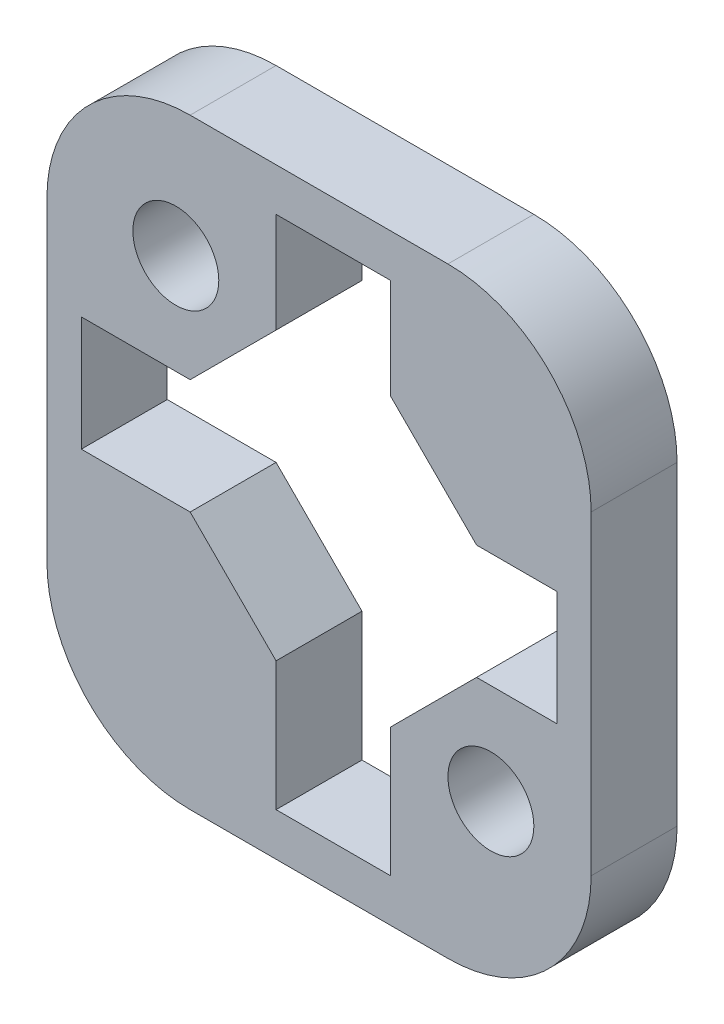
ISO-10303-21;
HEADER;
FILE_DESCRIPTION(('STEP AP214'),'2;1');
FILE_NAME('part.step','',(''),(''),'','','');
FILE_SCHEMA(('AUTOMOTIVE_DESIGN { 1 0 10303 214 1 1 1 1 }'));
ENDSEC;
DATA;
#1=APPLICATION_CONTEXT('core data for automotive mechanical design processes');
#2=APPLICATION_PROTOCOL_DEFINITION('international standard','automotive_design',2000,#1);
#3=PRODUCT_CONTEXT('',#1,'mechanical');
#4=PRODUCT('Part','Part','',(#3));
#5=PRODUCT_RELATED_PRODUCT_CATEGORY('part','',(#4));
#6=PRODUCT_DEFINITION_FORMATION('','',#4);
#7=PRODUCT_DEFINITION_CONTEXT('part definition',#1,'design');
#8=PRODUCT_DEFINITION('design','',#6,#7);
#9=PRODUCT_DEFINITION_SHAPE('','',#8);
#10=(LENGTH_UNIT() NAMED_UNIT(*) SI_UNIT(.MILLI.,.METRE.));
#11=(NAMED_UNIT(*) PLANE_ANGLE_UNIT() SI_UNIT($,.RADIAN.));
#12=(NAMED_UNIT(*) SI_UNIT($,.STERADIAN.) SOLID_ANGLE_UNIT());
#13=UNCERTAINTY_MEASURE_WITH_UNIT(LENGTH_MEASURE(1.E-05),#10,'distance_accuracy_value','');
#14=(GEOMETRIC_REPRESENTATION_CONTEXT(3) GLOBAL_UNCERTAINTY_ASSIGNED_CONTEXT((#13)) GLOBAL_UNIT_ASSIGNED_CONTEXT((#10,
#11,#12)) REPRESENTATION_CONTEXT('',''));
#15=CARTESIAN_POINT('',(0.,0.,0.));
#16=DIRECTION('',(0.,0.,1.));
#17=DIRECTION('',(1.,0.,0.));
#18=AXIS2_PLACEMENT_3D('',#15,#16,#17);
#19=CARTESIAN_POINT('',(4.5,-5.5,3.));
#20=DIRECTION('',(0.,0.,-1.));
#21=DIRECTION('',(-1.,0.,0.));
#22=AXIS2_PLACEMENT_3D('',#19,#20,#21);
#23=CYLINDRICAL_SURFACE('',#22,5.);
#24=CARTESIAN_POINT('',(4.5,-5.5,0.));
#25=DIRECTION('',(0.,0.,1.));
#26=DIRECTION('',(-1.,0.,0.));
#27=AXIS2_PLACEMENT_3D('',#24,#25,#26);
#28=CIRCLE('',#27,5.);
#29=CARTESIAN_POINT('',(4.5,-10.5,0.));
#30=VERTEX_POINT('',#29);
#31=CARTESIAN_POINT('',(9.5,-5.49999999999999,0.));
#32=VERTEX_POINT('',#31);
#33=EDGE_CURVE('E227',#30,#32,#28,.T.);
#34=ORIENTED_EDGE('',*,*,#33,.T.);
#35=DIRECTION('',(0.,0.,-1.));
#36=VECTOR('',#35,1.);
#37=CARTESIAN_POINT('',(9.5,-5.49999999999999,3.));
#38=LINE('',#37,#36);
#39=CARTESIAN_POINT('',(9.5,-5.49999999999999,3.));
#40=VERTEX_POINT('',#39);
#41=EDGE_CURVE('E291',#40,#32,#38,.T.);
#42=ORIENTED_EDGE('',*,*,#41,.F.);
#43=CARTESIAN_POINT('',(4.5,-5.5,3.));
#44=DIRECTION('',(0.,0.,1.));
#45=DIRECTION('',(-1.,0.,0.));
#46=AXIS2_PLACEMENT_3D('',#43,#44,#45);
#47=CIRCLE('',#46,5.);
#48=CARTESIAN_POINT('',(4.5,-10.5,3.));
#49=VERTEX_POINT('',#48);
#50=EDGE_CURVE('E237',#49,#40,#47,.T.);
#51=ORIENTED_EDGE('',*,*,#50,.F.);
#52=DIRECTION('',(0.,0.,-1.));
#53=VECTOR('',#52,1.);
#54=CARTESIAN_POINT('',(4.5,-10.5,3.));
#55=LINE('',#54,#53);
#56=EDGE_CURVE('E255',#49,#30,#55,.T.);
#57=ORIENTED_EDGE('',*,*,#56,.T.);
#58=EDGE_LOOP('',(#34,#42,#51,#57));
#59=FACE_BOUND('',#58,.T.);
#60=ADVANCED_FACE('F33',(#59),#23,.T.);
#61=CARTESIAN_POINT('',(9.5,5.50000000000001,3.));
#62=DIRECTION('',(-1.,0.,0.));
#63=DIRECTION('',(0.,-1.,0.));
#64=AXIS2_PLACEMENT_3D('',#61,#62,#63);
#65=PLANE('',#64);
#66=DIRECTION('',(0.,1.,0.));
#67=VECTOR('',#66,1.);
#68=CARTESIAN_POINT('',(9.5,5.50000000000001,0.));
#69=LINE('',#68,#67);
#70=CARTESIAN_POINT('',(9.5,5.50000000000001,0.));
#71=VERTEX_POINT('',#70);
#72=EDGE_CURVE('E258',#32,#71,#69,.T.);
#73=ORIENTED_EDGE('',*,*,#72,.T.);
#74=DIRECTION('',(0.,0.,-1.));
#75=VECTOR('',#74,1.);
#76=CARTESIAN_POINT('',(9.5,5.50000000000001,3.));
#77=LINE('',#76,#75);
#78=CARTESIAN_POINT('',(9.5,5.50000000000001,3.));
#79=VERTEX_POINT('',#78);
#80=EDGE_CURVE('E288',#79,#71,#77,.T.);
#81=ORIENTED_EDGE('',*,*,#80,.F.);
#82=DIRECTION('',(0.,1.,0.));
#83=VECTOR('',#82,1.);
#84=CARTESIAN_POINT('',(9.5,5.50000000000001,3.));
#85=LINE('',#84,#83);
#86=EDGE_CURVE('E240',#40,#79,#85,.T.);
#87=ORIENTED_EDGE('',*,*,#86,.F.);
#88=ORIENTED_EDGE('',*,*,#41,.T.);
#89=EDGE_LOOP('',(#73,#81,#87,#88));
#90=FACE_BOUND('',#89,.T.);
#91=ADVANCED_FACE('F455',(#90),#65,.F.);
#92=CARTESIAN_POINT('',(4.5,5.50000000000001,3.));
#93=DIRECTION('',(0.,0.,-1.));
#94=DIRECTION('',(-1.,0.,0.));
#95=AXIS2_PLACEMENT_3D('',#92,#93,#94);
#96=CYLINDRICAL_SURFACE('',#95,5.);
#97=CARTESIAN_POINT('',(4.5,5.50000000000001,0.));
#98=DIRECTION('',(0.,0.,1.));
#99=DIRECTION('',(-1.,0.,0.));
#100=AXIS2_PLACEMENT_3D('',#97,#98,#99);
#101=CIRCLE('',#100,5.);
#102=CARTESIAN_POINT('',(4.5,10.5,0.));
#103=VERTEX_POINT('',#102);
#104=EDGE_CURVE('E260',#71,#103,#101,.T.);
#105=ORIENTED_EDGE('',*,*,#104,.T.);
#106=DIRECTION('',(0.,0.,-1.));
#107=VECTOR('',#106,1.);
#108=CARTESIAN_POINT('',(4.5,10.5,3.));
#109=LINE('',#108,#107);
#110=CARTESIAN_POINT('',(4.5,10.5,3.));
#111=VERTEX_POINT('',#110);
#112=EDGE_CURVE('E285',#111,#103,#109,.T.);
#113=ORIENTED_EDGE('',*,*,#112,.F.);
#114=CARTESIAN_POINT('',(4.5,5.50000000000001,3.));
#115=DIRECTION('',(0.,0.,1.));
#116=DIRECTION('',(-1.,0.,0.));
#117=AXIS2_PLACEMENT_3D('',#114,#115,#116);
#118=CIRCLE('',#117,5.);
#119=EDGE_CURVE('E243',#79,#111,#118,.T.);
#120=ORIENTED_EDGE('',*,*,#119,.F.);
#121=ORIENTED_EDGE('',*,*,#80,.T.);
#122=EDGE_LOOP('',(#105,#113,#120,#121));
#123=FACE_BOUND('',#122,.T.);
#124=ADVANCED_FACE('F461',(#123),#96,.T.);
#125=CARTESIAN_POINT('',(4.5,10.5,3.));
#126=DIRECTION('',(0.,-1.,0.));
#127=DIRECTION('',(0.,0.,-1.));
#128=AXIS2_PLACEMENT_3D('',#125,#126,#127);
#129=PLANE('',#128);
#130=DIRECTION('',(-1.,0.,0.));
#131=VECTOR('',#130,1.);
#132=CARTESIAN_POINT('',(4.5,10.5,0.));
#133=LINE('',#132,#131);
#134=CARTESIAN_POINT('',(-4.5,10.5,0.));
#135=VERTEX_POINT('',#134);
#136=EDGE_CURVE('E262',#103,#135,#133,.T.);
#137=ORIENTED_EDGE('',*,*,#136,.T.);
#138=DIRECTION('',(0.,0.,-1.));
#139=VECTOR('',#138,1.);
#140=CARTESIAN_POINT('',(-4.5,10.5,3.));
#141=LINE('',#140,#139);
#142=CARTESIAN_POINT('',(-4.5,10.5,3.));
#143=VERTEX_POINT('',#142);
#144=EDGE_CURVE('E282',#143,#135,#141,.T.);
#145=ORIENTED_EDGE('',*,*,#144,.F.);
#146=DIRECTION('',(-1.,0.,0.));
#147=VECTOR('',#146,1.);
#148=CARTESIAN_POINT('',(4.5,10.5,3.));
#149=LINE('',#148,#147);
#150=EDGE_CURVE('E245',#111,#143,#149,.T.);
#151=ORIENTED_EDGE('',*,*,#150,.F.);
#152=ORIENTED_EDGE('',*,*,#112,.T.);
#153=EDGE_LOOP('',(#137,#145,#151,#152));
#154=FACE_BOUND('',#153,.T.);
#155=ADVANCED_FACE('F648',(#154),#129,.F.);
#156=CARTESIAN_POINT('',(-4.5,5.50000000000001,3.));
#157=DIRECTION('',(0.,0.,-1.));
#158=DIRECTION('',(-1.,0.,0.));
#159=AXIS2_PLACEMENT_3D('',#156,#157,#158);
#160=CYLINDRICAL_SURFACE('',#159,5.);
#161=CARTESIAN_POINT('',(-4.5,5.50000000000001,0.));
#162=DIRECTION('',(0.,0.,1.));
#163=DIRECTION('',(1.,0.,0.));
#164=AXIS2_PLACEMENT_3D('',#161,#162,#163);
#165=CIRCLE('',#164,5.);
#166=CARTESIAN_POINT('',(-9.5,5.50000000000001,0.));
#167=VERTEX_POINT('',#166);
#168=EDGE_CURVE('E264',#135,#167,#165,.T.);
#169=ORIENTED_EDGE('',*,*,#168,.T.);
#170=DIRECTION('',(0.,0.,-1.));
#171=VECTOR('',#170,1.);
#172=CARTESIAN_POINT('',(-9.5,5.50000000000001,3.));
#173=LINE('',#172,#171);
#174=CARTESIAN_POINT('',(-9.5,5.50000000000001,3.));
#175=VERTEX_POINT('',#174);
#176=EDGE_CURVE('E279',#175,#167,#173,.T.);
#177=ORIENTED_EDGE('',*,*,#176,.F.);
#178=CARTESIAN_POINT('',(-4.5,5.50000000000001,3.));
#179=DIRECTION('',(0.,0.,1.));
#180=DIRECTION('',(1.,0.,0.));
#181=AXIS2_PLACEMENT_3D('',#178,#179,#180);
#182=CIRCLE('',#181,5.);
#183=EDGE_CURVE('E247',#143,#175,#182,.T.);
#184=ORIENTED_EDGE('',*,*,#183,.F.);
#185=ORIENTED_EDGE('',*,*,#144,.T.);
#186=EDGE_LOOP('',(#169,#177,#184,#185));
#187=FACE_BOUND('',#186,.T.);
#188=ADVANCED_FACE('F639',(#187),#160,.T.);
#189=CARTESIAN_POINT('',(-9.5,5.5,3.));
#190=DIRECTION('',(1.,0.,0.));
#191=DIRECTION('',(0.,1.,0.));
#192=AXIS2_PLACEMENT_3D('',#189,#190,#191);
#193=PLANE('',#192);
#194=DIRECTION('',(0.,-1.,0.));
#195=VECTOR('',#194,1.);
#196=CARTESIAN_POINT('',(-9.5,5.5,0.));
#197=LINE('',#196,#195);
#198=CARTESIAN_POINT('',(-9.5,-5.5,0.));
#199=VERTEX_POINT('',#198);
#200=EDGE_CURVE('E266',#167,#199,#197,.T.);
#201=ORIENTED_EDGE('',*,*,#200,.T.);
#202=DIRECTION('',(0.,0.,-1.));
#203=VECTOR('',#202,1.);
#204=CARTESIAN_POINT('',(-9.5,-5.5,3.));
#205=LINE('',#204,#203);
#206=CARTESIAN_POINT('',(-9.5,-5.5,3.));
#207=VERTEX_POINT('',#206);
#208=EDGE_CURVE('E276',#207,#199,#205,.T.);
#209=ORIENTED_EDGE('',*,*,#208,.F.);
#210=DIRECTION('',(0.,-1.,0.));
#211=VECTOR('',#210,1.);
#212=CARTESIAN_POINT('',(-9.5,5.5,3.));
#213=LINE('',#212,#211);
#214=EDGE_CURVE('E249',#175,#207,#213,.T.);
#215=ORIENTED_EDGE('',*,*,#214,.F.);
#216=ORIENTED_EDGE('',*,*,#176,.T.);
#217=EDGE_LOOP('',(#201,#209,#215,#216));
#218=FACE_BOUND('',#217,.T.);
#219=ADVANCED_FACE('F630',(#218),#193,.F.);
#220=CARTESIAN_POINT('',(-4.5,-5.5,3.));
#221=DIRECTION('',(0.,0.,-1.));
#222=DIRECTION('',(-1.,0.,0.));
#223=AXIS2_PLACEMENT_3D('',#220,#221,#222);
#224=CYLINDRICAL_SURFACE('',#223,5.);
#225=CARTESIAN_POINT('',(-4.5,-5.5,0.));
#226=DIRECTION('',(0.,0.,1.));
#227=DIRECTION('',(-1.,0.,0.));
#228=AXIS2_PLACEMENT_3D('',#225,#226,#227);
#229=CIRCLE('',#228,5.);
#230=CARTESIAN_POINT('',(-4.5,-10.5,0.));
#231=VERTEX_POINT('',#230);
#232=EDGE_CURVE('E268',#199,#231,#229,.T.);
#233=ORIENTED_EDGE('',*,*,#232,.T.);
#234=DIRECTION('',(0.,0.,-1.));
#235=VECTOR('',#234,1.);
#236=CARTESIAN_POINT('',(-4.5,-10.5,3.));
#237=LINE('',#236,#235);
#238=CARTESIAN_POINT('',(-4.5,-10.5,3.));
#239=VERTEX_POINT('',#238);
#240=EDGE_CURVE('E273',#239,#231,#237,.T.);
#241=ORIENTED_EDGE('',*,*,#240,.F.);
#242=CARTESIAN_POINT('',(-4.5,-5.5,3.));
#243=DIRECTION('',(0.,0.,1.));
#244=DIRECTION('',(-1.,0.,0.));
#245=AXIS2_PLACEMENT_3D('',#242,#243,#244);
#246=CIRCLE('',#245,5.);
#247=EDGE_CURVE('E251',#207,#239,#246,.T.);
#248=ORIENTED_EDGE('',*,*,#247,.F.);
#249=ORIENTED_EDGE('',*,*,#208,.T.);
#250=EDGE_LOOP('',(#233,#241,#248,#249));
#251=FACE_BOUND('',#250,.T.);
#252=ADVANCED_FACE('F621',(#251),#224,.T.);
#253=CARTESIAN_POINT('',(4.5,-10.5,3.));
#254=DIRECTION('',(0.,1.,0.));
#255=DIRECTION('',(-1.,0.,0.));
#256=AXIS2_PLACEMENT_3D('',#253,#254,#255);
#257=PLANE('',#256);
#258=DIRECTION('',(1.,0.,0.));
#259=VECTOR('',#258,1.);
#260=CARTESIAN_POINT('',(4.5,-10.5,0.));
#261=LINE('',#260,#259);
#262=EDGE_CURVE('E241',#231,#30,#261,.T.);
#263=ORIENTED_EDGE('',*,*,#262,.T.);
#264=ORIENTED_EDGE('',*,*,#56,.F.);
#265=DIRECTION('',(1.,0.,0.));
#266=VECTOR('',#265,1.);
#267=CARTESIAN_POINT('',(4.5,-10.5,3.));
#268=LINE('',#267,#266);
#269=EDGE_CURVE('E253',#239,#49,#268,.T.);
#270=ORIENTED_EDGE('',*,*,#269,.F.);
#271=ORIENTED_EDGE('',*,*,#240,.T.);
#272=EDGE_LOOP('',(#263,#264,#270,#271));
#273=FACE_BOUND('',#272,.T.);
#274=ADVANCED_FACE('F485',(#273),#257,.F.);
#275=CARTESIAN_POINT('',(4.5,-5.5,3.));
#276=DIRECTION('',(0.,0.,-1.));
#277=DIRECTION('',(-1.,0.,0.));
#278=AXIS2_PLACEMENT_3D('',#275,#276,#277);
#279=PLANE('',#278);
#280=DIRECTION('',(0.,1.,0.));
#281=VECTOR('',#280,1.);
#282=CARTESIAN_POINT('',(8.3,-1.50000000000001,3.));
#283=LINE('',#282,#281);
#284=CARTESIAN_POINT('',(8.3,-1.50000000000001,3.));
#285=VERTEX_POINT('',#284);
#286=CARTESIAN_POINT('',(8.3,2.50000000000001,3.));
#287=VERTEX_POINT('',#286);
#288=EDGE_CURVE('E48',#285,#287,#283,.T.);
#289=ORIENTED_EDGE('',*,*,#288,.F.);
#290=DIRECTION('',(-1.,0.,0.));
#291=VECTOR('',#290,1.);
#292=CARTESIAN_POINT('',(2.5,-1.5,3.));
#293=LINE('',#292,#291);
#294=CARTESIAN_POINT('',(5.50000000000001,-1.50000000000001,3.));
#295=VERTEX_POINT('',#294);
#296=EDGE_CURVE('E215',#285,#295,#293,.T.);
#297=ORIENTED_EDGE('',*,*,#296,.T.);
#298=DIRECTION('',(0.707106781186549,0.707106781186546,0.));
#299=VECTOR('',#298,1.);
#300=CARTESIAN_POINT('',(2.5,-4.50000000000001,3.));
#301=LINE('',#300,#299);
#302=CARTESIAN_POINT('',(2.5,-4.50000000000001,3.));
#303=VERTEX_POINT('',#302);
#304=EDGE_CURVE('E315',#295,#303,#301,.F.);
#305=ORIENTED_EDGE('',*,*,#304,.T.);
#306=DIRECTION('',(0.,-1.,0.));
#307=VECTOR('',#306,1.);
#308=CARTESIAN_POINT('',(2.5,-1.5,3.));
#309=LINE('',#308,#307);
#310=CARTESIAN_POINT('',(2.5,-8.99999999999999,3.));
#311=VERTEX_POINT('',#310);
#312=EDGE_CURVE('E218',#303,#311,#309,.T.);
#313=ORIENTED_EDGE('',*,*,#312,.T.);
#314=DIRECTION('',(-1.,0.,0.));
#315=VECTOR('',#314,1.);
#316=CARTESIAN_POINT('',(-1.5,-8.99999999999999,3.));
#317=LINE('',#316,#315);
#318=CARTESIAN_POINT('',(-1.5,-8.99999999999999,3.));
#319=VERTEX_POINT('',#318);
#320=EDGE_CURVE('E393',#311,#319,#317,.T.);
#321=ORIENTED_EDGE('',*,*,#320,.T.);
#322=DIRECTION('',(0.,1.,0.));
#323=VECTOR('',#322,1.);
#324=CARTESIAN_POINT('',(-1.5,-1.5,3.));
#325=LINE('',#324,#323);
#326=CARTESIAN_POINT('',(-1.5,-4.50000000000002,3.));
#327=VERTEX_POINT('',#326);
#328=EDGE_CURVE('E392',#319,#327,#325,.T.);
#329=ORIENTED_EDGE('',*,*,#328,.T.);
#330=DIRECTION('',(0.707106781186546,-0.707106781186549,0.));
#331=VECTOR('',#330,1.);
#332=CARTESIAN_POINT('',(-4.5,-1.5,3.));
#333=LINE('',#332,#331);
#334=CARTESIAN_POINT('',(-4.5,-1.5,3.));
#335=VERTEX_POINT('',#334);
#336=EDGE_CURVE('E309',#327,#335,#333,.F.);
#337=ORIENTED_EDGE('',*,*,#336,.T.);
#338=DIRECTION('',(-1.,0.,0.));
#339=VECTOR('',#338,1.);
#340=CARTESIAN_POINT('',(-9.,-1.5,3.));
#341=LINE('',#340,#339);
#342=CARTESIAN_POINT('',(-8.3,-1.5,3.));
#343=VERTEX_POINT('',#342);
#344=EDGE_CURVE('E334',#335,#343,#341,.T.);
#345=ORIENTED_EDGE('',*,*,#344,.T.);
#346=DIRECTION('',(0.,-1.,0.));
#347=VECTOR('',#346,1.);
#348=CARTESIAN_POINT('',(-8.3,2.50000000000001,3.));
#349=LINE('',#348,#347);
#350=CARTESIAN_POINT('',(-8.3,2.50000000000001,3.));
#351=VERTEX_POINT('',#350);
#352=EDGE_CURVE('E56',#351,#343,#349,.T.);
#353=ORIENTED_EDGE('',*,*,#352,.F.);
#354=DIRECTION('',(1.,0.,0.));
#355=VECTOR('',#354,1.);
#356=CARTESIAN_POINT('',(-9.,2.50000000000001,3.));
#357=LINE('',#356,#355);
#358=CARTESIAN_POINT('',(-4.50000000000002,2.50000000000001,3.));
#359=VERTEX_POINT('',#358);
#360=EDGE_CURVE('E395',#351,#359,#357,.T.);
#361=ORIENTED_EDGE('',*,*,#360,.T.);
#362=DIRECTION('',(-0.707106781186549,-0.707106781186546,0.));
#363=VECTOR('',#362,1.);
#364=CARTESIAN_POINT('',(-1.5,5.50000000000001,3.));
#365=LINE('',#364,#363);
#366=CARTESIAN_POINT('',(-1.5,5.50000000000001,3.));
#367=VERTEX_POINT('',#366);
#368=EDGE_CURVE('E311',#359,#367,#365,.F.);
#369=ORIENTED_EDGE('',*,*,#368,.T.);
#370=DIRECTION('',(0.,1.,0.));
#371=VECTOR('',#370,1.);
#372=CARTESIAN_POINT('',(-1.5,9.00000000000001,3.));
#373=LINE('',#372,#371);
#374=CARTESIAN_POINT('',(-1.5,9.00000000000001,3.));
#375=VERTEX_POINT('',#374);
#376=EDGE_CURVE('E401',#367,#375,#373,.T.);
#377=ORIENTED_EDGE('',*,*,#376,.T.);
#378=DIRECTION('',(1.,0.,0.));
#379=VECTOR('',#378,1.);
#380=CARTESIAN_POINT('',(-1.5,9.00000000000001,3.));
#381=LINE('',#380,#379);
#382=CARTESIAN_POINT('',(2.5,9.00000000000001,3.));
#383=VERTEX_POINT('',#382);
#384=EDGE_CURVE('E372',#375,#383,#381,.T.);
#385=ORIENTED_EDGE('',*,*,#384,.T.);
#386=DIRECTION('',(0.,-1.,0.));
#387=VECTOR('',#386,1.);
#388=CARTESIAN_POINT('',(2.5,9.00000000000001,3.));
#389=LINE('',#388,#387);
#390=CARTESIAN_POINT('',(2.5,5.50000000000001,3.));
#391=VERTEX_POINT('',#390);
#392=EDGE_CURVE('E370',#383,#391,#389,.T.);
#393=ORIENTED_EDGE('',*,*,#392,.T.);
#394=DIRECTION('',(-0.707106781186546,0.707106781186549,0.));
#395=VECTOR('',#394,1.);
#396=CARTESIAN_POINT('',(5.5,2.50000000000001,3.));
#397=LINE('',#396,#395);
#398=CARTESIAN_POINT('',(5.5,2.50000000000001,3.));
#399=VERTEX_POINT('',#398);
#400=EDGE_CURVE('E313',#391,#399,#397,.F.);
#401=ORIENTED_EDGE('',*,*,#400,.T.);
#402=DIRECTION('',(1.,0.,0.));
#403=VECTOR('',#402,1.);
#404=CARTESIAN_POINT('',(2.5,2.5,3.));
#405=LINE('',#404,#403);
#406=EDGE_CURVE('E236',#399,#287,#405,.T.);
#407=ORIENTED_EDGE('',*,*,#406,.T.);
#408=EDGE_LOOP('',(#289,#297,#305,#313,#321,#329,#337,#345,#353,#361,#369,#377,#385,#393,#401,#407));
#409=FACE_BOUND('',#408,.T.);
#410=CARTESIAN_POINT('',(6.,-5.00000000000001,3.));
#411=DIRECTION('',(0.,0.,1.));
#412=DIRECTION('',(1.,0.,0.));
#413=AXIS2_PLACEMENT_3D('',#410,#411,#412);
#414=CIRCLE('',#413,1.5);
#415=CARTESIAN_POINT('',(7.5,-5.00000000000001,3.));
#416=VERTEX_POINT('',#415);
#417=EDGE_CURVE('E424',#416,#416,#414,.T.);
#418=ORIENTED_EDGE('',*,*,#417,.F.);
#419=EDGE_LOOP('',(#418));
#420=FACE_BOUND('',#419,.T.);
#421=CARTESIAN_POINT('',(-5.,6.00000000000001,3.));
#422=DIRECTION('',(0.,0.,1.));
#423=DIRECTION('',(1.,0.,0.));
#424=AXIS2_PLACEMENT_3D('',#421,#422,#423);
#425=CIRCLE('',#424,1.5);
#426=CARTESIAN_POINT('',(-3.5,6.00000000000001,3.));
#427=VERTEX_POINT('',#426);
#428=EDGE_CURVE('E416',#427,#427,#425,.T.);
#429=ORIENTED_EDGE('',*,*,#428,.F.);
#430=EDGE_LOOP('',(#429));
#431=FACE_BOUND('',#430,.T.);
#432=ORIENTED_EDGE('',*,*,#50,.T.);
#433=ORIENTED_EDGE('',*,*,#86,.T.);
#434=ORIENTED_EDGE('',*,*,#119,.T.);
#435=ORIENTED_EDGE('',*,*,#150,.T.);
#436=ORIENTED_EDGE('',*,*,#183,.T.);
#437=ORIENTED_EDGE('',*,*,#214,.T.);
#438=ORIENTED_EDGE('',*,*,#247,.T.);
#439=ORIENTED_EDGE('',*,*,#269,.T.);
#440=EDGE_LOOP('',(#432,#433,#434,#435,#436,#437,#438,#439));
#441=FACE_BOUND('',#440,.T.);
#442=ADVANCED_FACE('F367',(#409,#420,#431,#441),#279,.F.);
#443=CARTESIAN_POINT('',(4.5,-5.5,0.));
#444=DIRECTION('',(0.,0.,-1.));
#445=DIRECTION('',(-1.,0.,0.));
#446=AXIS2_PLACEMENT_3D('',#443,#444,#445);
#447=PLANE('',#446);
#448=DIRECTION('',(-1.,0.,0.));
#449=VECTOR('',#448,1.);
#450=CARTESIAN_POINT('',(2.5,-1.5,0.));
#451=LINE('',#450,#449);
#452=CARTESIAN_POINT('',(8.3,-1.50000000000001,0.));
#453=VERTEX_POINT('',#452);
#454=CARTESIAN_POINT('',(5.50000000000001,-1.50000000000001,0.));
#455=VERTEX_POINT('',#454);
#456=EDGE_CURVE('E201',#453,#455,#451,.T.);
#457=ORIENTED_EDGE('',*,*,#456,.F.);
#458=DIRECTION('',(0.,-1.,0.));
#459=VECTOR('',#458,1.);
#460=CARTESIAN_POINT('',(8.3,2.50000000000001,0.));
#461=LINE('',#460,#459);
#462=CARTESIAN_POINT('',(8.3,2.50000000000001,0.));
#463=VERTEX_POINT('',#462);
#464=EDGE_CURVE('E195',#463,#453,#461,.T.);
#465=ORIENTED_EDGE('',*,*,#464,.F.);
#466=DIRECTION('',(1.,0.,0.));
#467=VECTOR('',#466,1.);
#468=CARTESIAN_POINT('',(2.5,2.5,0.));
#469=LINE('',#468,#467);
#470=CARTESIAN_POINT('',(5.5,2.50000000000001,0.));
#471=VERTEX_POINT('',#470);
#472=EDGE_CURVE('E199',#471,#463,#469,.T.);
#473=ORIENTED_EDGE('',*,*,#472,.F.);
#474=DIRECTION('',(0.707106781186546,-0.707106781186549,0.));
#475=VECTOR('',#474,1.);
#476=CARTESIAN_POINT('',(9.,-1.00000000000001,0.));
#477=LINE('',#476,#475);
#478=CARTESIAN_POINT('',(2.5,5.50000000000001,0.));
#479=VERTEX_POINT('',#478);
#480=EDGE_CURVE('E302',#471,#479,#477,.F.);
#481=ORIENTED_EDGE('',*,*,#480,.T.);
#482=DIRECTION('',(0.,-1.,0.));
#483=VECTOR('',#482,1.);
#484=CARTESIAN_POINT('',(2.5,9.00000000000001,0.));
#485=LINE('',#484,#483);
#486=CARTESIAN_POINT('',(2.5,9.00000000000001,0.));
#487=VERTEX_POINT('',#486);
#488=EDGE_CURVE('E216',#487,#479,#485,.T.);
#489=ORIENTED_EDGE('',*,*,#488,.F.);
#490=DIRECTION('',(1.,0.,0.));
#491=VECTOR('',#490,1.);
#492=CARTESIAN_POINT('',(-1.5,9.00000000000001,0.));
#493=LINE('',#492,#491);
#494=CARTESIAN_POINT('',(-1.5,9.00000000000001,0.));
#495=VERTEX_POINT('',#494);
#496=EDGE_CURVE('E221',#495,#487,#493,.T.);
#497=ORIENTED_EDGE('',*,*,#496,.F.);
#498=DIRECTION('',(0.,1.,0.));
#499=VECTOR('',#498,1.);
#500=CARTESIAN_POINT('',(-1.5,9.00000000000001,0.));
#501=LINE('',#500,#499);
#502=CARTESIAN_POINT('',(-1.5,5.50000000000001,0.));
#503=VERTEX_POINT('',#502);
#504=EDGE_CURVE('E344',#503,#495,#501,.T.);
#505=ORIENTED_EDGE('',*,*,#504,.F.);
#506=DIRECTION('',(0.707106781186549,0.707106781186546,0.));
#507=VECTOR('',#506,1.);
#508=CARTESIAN_POINT('',(-3.99999999999999,3.00000000000003,0.));
#509=LINE('',#508,#507);
#510=CARTESIAN_POINT('',(-4.50000000000002,2.50000000000001,0.));
#511=VERTEX_POINT('',#510);
#512=EDGE_CURVE('E299',#503,#511,#509,.F.);
#513=ORIENTED_EDGE('',*,*,#512,.T.);
#514=DIRECTION('',(1.,0.,0.));
#515=VECTOR('',#514,1.);
#516=CARTESIAN_POINT('',(-9.,2.50000000000001,0.));
#517=LINE('',#516,#515);
#518=CARTESIAN_POINT('',(-8.3,2.50000000000001,0.));
#519=VERTEX_POINT('',#518);
#520=EDGE_CURVE('E341',#519,#511,#517,.T.);
#521=ORIENTED_EDGE('',*,*,#520,.F.);
#522=DIRECTION('',(0.,1.,0.));
#523=VECTOR('',#522,1.);
#524=CARTESIAN_POINT('',(-8.3,-1.5,0.));
#525=LINE('',#524,#523);
#526=CARTESIAN_POINT('',(-8.3,-1.5,0.));
#527=VERTEX_POINT('',#526);
#528=EDGE_CURVE('E340',#527,#519,#525,.T.);
#529=ORIENTED_EDGE('',*,*,#528,.F.);
#530=DIRECTION('',(-1.,0.,0.));
#531=VECTOR('',#530,1.);
#532=CARTESIAN_POINT('',(-9.,-1.5,0.));
#533=LINE('',#532,#531);
#534=CARTESIAN_POINT('',(-4.5,-1.5,0.));
#535=VERTEX_POINT('',#534);
#536=EDGE_CURVE('E332',#535,#527,#533,.T.);
#537=ORIENTED_EDGE('',*,*,#536,.F.);
#538=DIRECTION('',(-0.707106781186546,0.707106781186549,0.));
#539=VECTOR('',#538,1.);
#540=CARTESIAN_POINT('',(1.99999999999998,-8.00000000000001,0.));
#541=LINE('',#540,#539);
#542=CARTESIAN_POINT('',(-1.5,-4.50000000000002,0.));
#543=VERTEX_POINT('',#542);
#544=EDGE_CURVE('E297',#535,#543,#541,.F.);
#545=ORIENTED_EDGE('',*,*,#544,.T.);
#546=DIRECTION('',(0.,1.,0.));
#547=VECTOR('',#546,1.);
#548=CARTESIAN_POINT('',(-1.5,-1.5,0.));
#549=LINE('',#548,#547);
#550=CARTESIAN_POINT('',(-1.5,-8.99999999999999,0.));
#551=VERTEX_POINT('',#550);
#552=EDGE_CURVE('E342',#551,#543,#549,.T.);
#553=ORIENTED_EDGE('',*,*,#552,.F.);
#554=DIRECTION('',(-1.,0.,0.));
#555=VECTOR('',#554,1.);
#556=CARTESIAN_POINT('',(-1.5,-8.99999999999999,0.));
#557=LINE('',#556,#555);
#558=CARTESIAN_POINT('',(2.5,-8.99999999999999,0.));
#559=VERTEX_POINT('',#558);
#560=EDGE_CURVE('E346',#559,#551,#557,.T.);
#561=ORIENTED_EDGE('',*,*,#560,.F.);
#562=DIRECTION('',(0.,-1.,0.));
#563=VECTOR('',#562,1.);
#564=CARTESIAN_POINT('',(2.5,-1.5,0.));
#565=LINE('',#564,#563);
#566=CARTESIAN_POINT('',(2.5,-4.50000000000001,0.));
#567=VERTEX_POINT('',#566);
#568=EDGE_CURVE('E377',#567,#559,#565,.T.);
#569=ORIENTED_EDGE('',*,*,#568,.F.);
#570=DIRECTION('',(-0.707106781186549,-0.707106781186546,0.));
#571=VECTOR('',#570,1.);
#572=CARTESIAN_POINT('',(3.00000000000001,-4.,0.));
#573=LINE('',#572,#571);
#574=EDGE_CURVE('E304',#567,#455,#573,.F.);
#575=ORIENTED_EDGE('',*,*,#574,.T.);
#576=EDGE_LOOP('',(#457,#465,#473,#481,#489,#497,#505,#513,#521,#529,#537,#545,#553,#561,#569,#575));
#577=FACE_BOUND('',#576,.T.);
#578=CARTESIAN_POINT('',(6.,-5.00000000000001,0.));
#579=DIRECTION('',(0.,0.,1.));
#580=DIRECTION('',(1.,0.,0.));
#581=AXIS2_PLACEMENT_3D('',#578,#579,#580);
#582=CIRCLE('',#581,1.5);
#583=CARTESIAN_POINT('',(7.5,-5.00000000000001,0.));
#584=VERTEX_POINT('',#583);
#585=EDGE_CURVE('E378',#584,#584,#582,.T.);
#586=ORIENTED_EDGE('',*,*,#585,.T.);
#587=EDGE_LOOP('',(#586));
#588=FACE_BOUND('',#587,.T.);
#589=CARTESIAN_POINT('',(-5.,6.00000000000001,0.));
#590=DIRECTION('',(0.,0.,1.));
#591=DIRECTION('',(1.,0.,0.));
#592=AXIS2_PLACEMENT_3D('',#589,#590,#591);
#593=CIRCLE('',#592,1.5);
#594=CARTESIAN_POINT('',(-3.5,6.00000000000001,0.));
#595=VERTEX_POINT('',#594);
#596=EDGE_CURVE('E427',#595,#595,#593,.T.);
#597=ORIENTED_EDGE('',*,*,#596,.T.);
#598=EDGE_LOOP('',(#597));
#599=FACE_BOUND('',#598,.T.);
#600=ORIENTED_EDGE('',*,*,#33,.F.);
#601=ORIENTED_EDGE('',*,*,#262,.F.);
#602=ORIENTED_EDGE('',*,*,#232,.F.);
#603=ORIENTED_EDGE('',*,*,#200,.F.);
#604=ORIENTED_EDGE('',*,*,#168,.F.);
#605=ORIENTED_EDGE('',*,*,#136,.F.);
#606=ORIENTED_EDGE('',*,*,#104,.F.);
#607=ORIENTED_EDGE('',*,*,#72,.F.);
#608=EDGE_LOOP('',(#600,#601,#602,#603,#604,#605,#606,#607));
#609=FACE_BOUND('',#608,.T.);
#610=ADVANCED_FACE('F196',(#577,#588,#599,#609),#447,.T.);
#611=CARTESIAN_POINT('',(2.5,-1.5,3.));
#612=DIRECTION('',(0.,-1.,0.));
#613=DIRECTION('',(1.,0.,0.));
#614=AXIS2_PLACEMENT_3D('',#611,#612,#613);
#615=PLANE('',#614);
#616=ORIENTED_EDGE('',*,*,#296,.F.);
#617=DIRECTION('',(0.,0.,1.));
#618=VECTOR('',#617,1.);
#619=CARTESIAN_POINT('',(8.3,-1.50000000000001,0.));
#620=LINE('',#619,#618);
#621=EDGE_CURVE('E203',#453,#285,#620,.T.);
#622=ORIENTED_EDGE('',*,*,#621,.F.);
#623=ORIENTED_EDGE('',*,*,#456,.T.);
#624=DIRECTION('',(0.,0.,1.));
#625=VECTOR('',#624,1.);
#626=CARTESIAN_POINT('',(5.50000000000001,-1.50000000000001,3.));
#627=LINE('',#626,#625);
#628=EDGE_CURVE('E306',#455,#295,#627,.T.);
#629=ORIENTED_EDGE('',*,*,#628,.T.);
#630=EDGE_LOOP('',(#616,#622,#623,#629));
#631=FACE_BOUND('',#630,.T.);
#632=ADVANCED_FACE('F441',(#631),#615,.F.);
#633=CARTESIAN_POINT('',(2.5,2.5,3.));
#634=DIRECTION('',(0.,1.,0.));
#635=DIRECTION('',(-1.,0.,0.));
#636=AXIS2_PLACEMENT_3D('',#633,#634,#635);
#637=PLANE('',#636);
#638=ORIENTED_EDGE('',*,*,#472,.T.);
#639=DIRECTION('',(0.,0.,-1.));
#640=VECTOR('',#639,1.);
#641=CARTESIAN_POINT('',(8.3,2.50000000000001,3.));
#642=LINE('',#641,#640);
#643=EDGE_CURVE('E204',#287,#463,#642,.T.);
#644=ORIENTED_EDGE('',*,*,#643,.F.);
#645=ORIENTED_EDGE('',*,*,#406,.F.);
#646=DIRECTION('',(0.,0.,-1.));
#647=VECTOR('',#646,1.);
#648=CARTESIAN_POINT('',(5.5,2.50000000000001,3.));
#649=LINE('',#648,#647);
#650=EDGE_CURVE('E214',#399,#471,#649,.T.);
#651=ORIENTED_EDGE('',*,*,#650,.T.);
#652=EDGE_LOOP('',(#638,#644,#645,#651));
#653=FACE_BOUND('',#652,.T.);
#654=ADVANCED_FACE('F212',(#653),#637,.F.);
#655=CARTESIAN_POINT('',(2.5,9.00000000000001,3.));
#656=DIRECTION('',(1.,0.,0.));
#657=DIRECTION('',(0.,0.,-1.));
#658=AXIS2_PLACEMENT_3D('',#655,#656,#657);
#659=PLANE('',#658);
#660=ORIENTED_EDGE('',*,*,#488,.T.);
#661=DIRECTION('',(0.,0.,1.));
#662=VECTOR('',#661,1.);
#663=CARTESIAN_POINT('',(2.5,5.50000000000001,3.));
#664=LINE('',#663,#662);
#665=EDGE_CURVE('E318',#479,#391,#664,.T.);
#666=ORIENTED_EDGE('',*,*,#665,.T.);
#667=ORIENTED_EDGE('',*,*,#392,.F.);
#668=DIRECTION('',(0.,0.,-1.));
#669=VECTOR('',#668,1.);
#670=CARTESIAN_POINT('',(2.5,9.00000000000001,3.));
#671=LINE('',#670,#669);
#672=EDGE_CURVE('E225',#383,#487,#671,.T.);
#673=ORIENTED_EDGE('',*,*,#672,.T.);
#674=EDGE_LOOP('',(#660,#666,#667,#673));
#675=FACE_BOUND('',#674,.T.);
#676=ADVANCED_FACE('F361',(#675),#659,.F.);
#677=CARTESIAN_POINT('',(-1.5,9.00000000000001,3.));
#678=DIRECTION('',(0.,1.,0.));
#679=DIRECTION('',(-1.,0.,0.));
#680=AXIS2_PLACEMENT_3D('',#677,#678,#679);
#681=PLANE('',#680);
#682=ORIENTED_EDGE('',*,*,#496,.T.);
#683=ORIENTED_EDGE('',*,*,#672,.F.);
#684=ORIENTED_EDGE('',*,*,#384,.F.);
#685=DIRECTION('',(0.,0.,-1.));
#686=VECTOR('',#685,1.);
#687=CARTESIAN_POINT('',(-1.5,9.00000000000001,3.));
#688=LINE('',#687,#686);
#689=EDGE_CURVE('E228',#375,#495,#688,.T.);
#690=ORIENTED_EDGE('',*,*,#689,.T.);
#691=EDGE_LOOP('',(#682,#683,#684,#690));
#692=FACE_BOUND('',#691,.T.);
#693=ADVANCED_FACE('F354',(#692),#681,.F.);
#694=CARTESIAN_POINT('',(-1.5,9.00000000000001,3.));
#695=DIRECTION('',(-1.,0.,0.));
#696=DIRECTION('',(0.,-1.,0.));
#697=AXIS2_PLACEMENT_3D('',#694,#695,#696);
#698=PLANE('',#697);
#699=ORIENTED_EDGE('',*,*,#376,.F.);
#700=DIRECTION('',(0.,0.,-1.));
#701=VECTOR('',#700,1.);
#702=CARTESIAN_POINT('',(-1.5,5.50000000000001,3.));
#703=LINE('',#702,#701);
#704=EDGE_CURVE('E320',#367,#503,#703,.T.);
#705=ORIENTED_EDGE('',*,*,#704,.T.);
#706=ORIENTED_EDGE('',*,*,#504,.T.);
#707=ORIENTED_EDGE('',*,*,#689,.F.);
#708=EDGE_LOOP('',(#699,#705,#706,#707));
#709=FACE_BOUND('',#708,.T.);
#710=ADVANCED_FACE('F406',(#709),#698,.F.);
#711=CARTESIAN_POINT('',(-9.,2.50000000000001,3.));
#712=DIRECTION('',(0.,1.,0.));
#713=DIRECTION('',(-1.,0.,0.));
#714=AXIS2_PLACEMENT_3D('',#711,#712,#713);
#715=PLANE('',#714);
#716=ORIENTED_EDGE('',*,*,#360,.F.);
#717=DIRECTION('',(0.,0.,1.));
#718=VECTOR('',#717,1.);
#719=CARTESIAN_POINT('',(-8.3,2.50000000000001,0.));
#720=LINE('',#719,#718);
#721=EDGE_CURVE('E414',#519,#351,#720,.T.);
#722=ORIENTED_EDGE('',*,*,#721,.F.);
#723=ORIENTED_EDGE('',*,*,#520,.T.);
#724=DIRECTION('',(0.,0.,1.));
#725=VECTOR('',#724,1.);
#726=CARTESIAN_POINT('',(-4.50000000000001,2.50000000000001,3.));
#727=LINE('',#726,#725);
#728=EDGE_CURVE('E323',#511,#359,#727,.T.);
#729=ORIENTED_EDGE('',*,*,#728,.T.);
#730=EDGE_LOOP('',(#716,#722,#723,#729));
#731=FACE_BOUND('',#730,.T.);
#732=ADVANCED_FACE('F412',(#731),#715,.F.);
#733=CARTESIAN_POINT('',(-9.,-1.5,3.));
#734=DIRECTION('',(0.,-1.,0.));
#735=DIRECTION('',(1.,0.,0.));
#736=AXIS2_PLACEMENT_3D('',#733,#734,#735);
#737=PLANE('',#736);
#738=ORIENTED_EDGE('',*,*,#536,.T.);
#739=DIRECTION('',(0.,0.,-1.));
#740=VECTOR('',#739,1.);
#741=CARTESIAN_POINT('',(-8.3,-1.5,3.));
#742=LINE('',#741,#740);
#743=EDGE_CURVE('E418',#343,#527,#742,.T.);
#744=ORIENTED_EDGE('',*,*,#743,.F.);
#745=ORIENTED_EDGE('',*,*,#344,.F.);
#746=DIRECTION('',(0.,0.,-1.));
#747=VECTOR('',#746,1.);
#748=CARTESIAN_POINT('',(-4.5,-1.5,3.));
#749=LINE('',#748,#747);
#750=EDGE_CURVE('E41',#335,#535,#749,.T.);
#751=ORIENTED_EDGE('',*,*,#750,.T.);
#752=EDGE_LOOP('',(#738,#744,#745,#751));
#753=FACE_BOUND('',#752,.T.);
#754=ADVANCED_FACE('F331',(#753),#737,.F.);
#755=CARTESIAN_POINT('',(-1.5,-1.5,3.));
#756=DIRECTION('',(-1.,0.,0.));
#757=DIRECTION('',(0.,-1.,0.));
#758=AXIS2_PLACEMENT_3D('',#755,#756,#757);
#759=PLANE('',#758);
#760=ORIENTED_EDGE('',*,*,#552,.T.);
#761=DIRECTION('',(0.,0.,1.));
#762=VECTOR('',#761,1.);
#763=CARTESIAN_POINT('',(-1.5,-4.50000000000002,3.));
#764=LINE('',#763,#762);
#765=EDGE_CURVE('E11',#543,#327,#764,.T.);
#766=ORIENTED_EDGE('',*,*,#765,.T.);
#767=ORIENTED_EDGE('',*,*,#328,.F.);
#768=DIRECTION('',(0.,0.,-1.));
#769=VECTOR('',#768,1.);
#770=CARTESIAN_POINT('',(-1.5,-8.99999999999999,3.));
#771=LINE('',#770,#769);
#772=EDGE_CURVE('E231',#319,#551,#771,.T.);
#773=ORIENTED_EDGE('',*,*,#772,.T.);
#774=EDGE_LOOP('',(#760,#766,#767,#773));
#775=FACE_BOUND('',#774,.T.);
#776=ADVANCED_FACE('F389',(#775),#759,.F.);
#777=CARTESIAN_POINT('',(-1.5,-8.99999999999999,3.));
#778=DIRECTION('',(0.,-1.,0.));
#779=DIRECTION('',(1.,0.,0.));
#780=AXIS2_PLACEMENT_3D('',#777,#778,#779);
#781=PLANE('',#780);
#782=ORIENTED_EDGE('',*,*,#560,.T.);
#783=ORIENTED_EDGE('',*,*,#772,.F.);
#784=ORIENTED_EDGE('',*,*,#320,.F.);
#785=DIRECTION('',(0.,0.,-1.));
#786=VECTOR('',#785,1.);
#787=CARTESIAN_POINT('',(2.5,-8.99999999999999,3.));
#788=LINE('',#787,#786);
#789=EDGE_CURVE('E233',#311,#559,#788,.T.);
#790=ORIENTED_EDGE('',*,*,#789,.T.);
#791=EDGE_LOOP('',(#782,#783,#784,#790));
#792=FACE_BOUND('',#791,.T.);
#793=ADVANCED_FACE('F382',(#792),#781,.F.);
#794=CARTESIAN_POINT('',(2.5,-1.5,3.));
#795=DIRECTION('',(1.,0.,0.));
#796=DIRECTION('',(0.,1.,0.));
#797=AXIS2_PLACEMENT_3D('',#794,#795,#796);
#798=PLANE('',#797);
#799=ORIENTED_EDGE('',*,*,#312,.F.);
#800=DIRECTION('',(0.,0.,-1.));
#801=VECTOR('',#800,1.);
#802=CARTESIAN_POINT('',(2.5,-4.50000000000001,3.));
#803=LINE('',#802,#801);
#804=EDGE_CURVE('E294',#303,#567,#803,.T.);
#805=ORIENTED_EDGE('',*,*,#804,.T.);
#806=ORIENTED_EDGE('',*,*,#568,.T.);
#807=ORIENTED_EDGE('',*,*,#789,.F.);
#808=EDGE_LOOP('',(#799,#805,#806,#807));
#809=FACE_BOUND('',#808,.T.);
#810=ADVANCED_FACE('F435',(#809),#798,.F.);
#811=CARTESIAN_POINT('',(-5.,6.00000000000001,0.));
#812=DIRECTION('',(0.,0.,1.));
#813=DIRECTION('',(1.,0.,0.));
#814=AXIS2_PLACEMENT_3D('',#811,#812,#813);
#815=CYLINDRICAL_SURFACE('',#814,1.5);
#816=ORIENTED_EDGE('',*,*,#596,.F.);
#817=EDGE_LOOP('',(#816));
#818=FACE_BOUND('',#817,.T.);
#819=ORIENTED_EDGE('',*,*,#428,.T.);
#820=EDGE_LOOP('',(#819));
#821=FACE_BOUND('',#820,.T.);
#822=ADVANCED_FACE('F570',(#818,#821),#815,.F.);
#823=CARTESIAN_POINT('',(6.,-5.00000000000001,0.));
#824=DIRECTION('',(0.,0.,1.));
#825=DIRECTION('',(1.,0.,0.));
#826=AXIS2_PLACEMENT_3D('',#823,#824,#825);
#827=CYLINDRICAL_SURFACE('',#826,1.5);
#828=ORIENTED_EDGE('',*,*,#585,.F.);
#829=EDGE_LOOP('',(#828));
#830=FACE_BOUND('',#829,.T.);
#831=ORIENTED_EDGE('',*,*,#417,.T.);
#832=EDGE_LOOP('',(#831));
#833=FACE_BOUND('',#832,.T.);
#834=ADVANCED_FACE('F468',(#830,#833),#827,.F.);
#835=CARTESIAN_POINT('',(2.5,-4.50000000000001,3.));
#836=DIRECTION('',(0.707106781186546,-0.707106781186549,0.));
#837=DIRECTION('',(0.,0.,-1.));
#838=AXIS2_PLACEMENT_3D('',#835,#836,#837);
#839=PLANE('',#838);
#840=ORIENTED_EDGE('',*,*,#304,.F.);
#841=ORIENTED_EDGE('',*,*,#628,.F.);
#842=ORIENTED_EDGE('',*,*,#574,.F.);
#843=ORIENTED_EDGE('',*,*,#804,.F.);
#844=EDGE_LOOP('',(#840,#841,#842,#843));
#845=FACE_BOUND('',#844,.T.);
#846=ADVANCED_FACE('F438',(#845),#839,.F.);
#847=CARTESIAN_POINT('',(5.5,2.50000000000001,3.));
#848=DIRECTION('',(0.707106781186549,0.707106781186546,0.));
#849=DIRECTION('',(0.,0.,-1.));
#850=AXIS2_PLACEMENT_3D('',#847,#848,#849);
#851=PLANE('',#850);
#852=ORIENTED_EDGE('',*,*,#400,.F.);
#853=ORIENTED_EDGE('',*,*,#665,.F.);
#854=ORIENTED_EDGE('',*,*,#480,.F.);
#855=ORIENTED_EDGE('',*,*,#650,.F.);
#856=EDGE_LOOP('',(#852,#853,#854,#855));
#857=FACE_BOUND('',#856,.T.);
#858=ADVANCED_FACE('F365',(#857),#851,.F.);
#859=CARTESIAN_POINT('',(-1.5,5.50000000000001,3.));
#860=DIRECTION('',(-0.707106781186546,0.707106781186549,0.));
#861=DIRECTION('',(0.,0.,-1.));
#862=AXIS2_PLACEMENT_3D('',#859,#860,#861);
#863=PLANE('',#862);
#864=ORIENTED_EDGE('',*,*,#368,.F.);
#865=ORIENTED_EDGE('',*,*,#728,.F.);
#866=ORIENTED_EDGE('',*,*,#512,.F.);
#867=ORIENTED_EDGE('',*,*,#704,.F.);
#868=EDGE_LOOP('',(#864,#865,#866,#867));
#869=FACE_BOUND('',#868,.T.);
#870=ADVANCED_FACE('F409',(#869),#863,.F.);
#871=CARTESIAN_POINT('',(-4.5,-1.5,3.));
#872=DIRECTION('',(-0.707106781186549,-0.707106781186546,0.));
#873=DIRECTION('',(0.,0.,-1.));
#874=AXIS2_PLACEMENT_3D('',#871,#872,#873);
#875=PLANE('',#874);
#876=ORIENTED_EDGE('',*,*,#336,.F.);
#877=ORIENTED_EDGE('',*,*,#765,.F.);
#878=ORIENTED_EDGE('',*,*,#544,.F.);
#879=ORIENTED_EDGE('',*,*,#750,.F.);
#880=EDGE_LOOP('',(#876,#877,#878,#879));
#881=FACE_BOUND('',#880,.T.);
#882=ADVANCED_FACE('F35',(#881),#875,.F.);
#883=CARTESIAN_POINT('',(-8.3,0.,0.));
#884=DIRECTION('',(1.,0.,0.));
#885=DIRECTION('',(0.,0.,-1.));
#886=AXIS2_PLACEMENT_3D('',#883,#884,#885);
#887=PLANE('',#886);
#888=ORIENTED_EDGE('',*,*,#743,.T.);
#889=ORIENTED_EDGE('',*,*,#528,.T.);
#890=ORIENTED_EDGE('',*,*,#721,.T.);
#891=ORIENTED_EDGE('',*,*,#352,.T.);
#892=EDGE_LOOP('',(#888,#889,#890,#891));
#893=FACE_BOUND('',#892,.T.);
#894=ADVANCED_FACE('F444',(#893),#887,.T.);
#895=CARTESIAN_POINT('',(8.3,0.,0.));
#896=DIRECTION('',(-1.,0.,0.));
#897=DIRECTION('',(0.,0.,1.));
#898=AXIS2_PLACEMENT_3D('',#895,#896,#897);
#899=PLANE('',#898);
#900=ORIENTED_EDGE('',*,*,#643,.T.);
#901=ORIENTED_EDGE('',*,*,#464,.T.);
#902=ORIENTED_EDGE('',*,*,#621,.T.);
#903=ORIENTED_EDGE('',*,*,#288,.T.);
#904=EDGE_LOOP('',(#900,#901,#902,#903));
#905=FACE_BOUND('',#904,.T.);
#906=ADVANCED_FACE('F206',(#905),#899,.T.);
#907=CLOSED_SHELL('',(#60,#91,#124,#155,#188,#219,#252,#274,#442,#610,#632,#654,#676,#693,#710,
#732,#754,#776,#793,#810,#822,#834,#846,#858,#870,#882,#894,#906));
#908=MANIFOLD_SOLID_BREP('B2',#907);
#909=ADVANCED_BREP_SHAPE_REPRESENTATION('',(#18,#908),#14);
#910=SHAPE_DEFINITION_REPRESENTATION(#9,#909);
ENDSEC;
END-ISO-10303-21;
